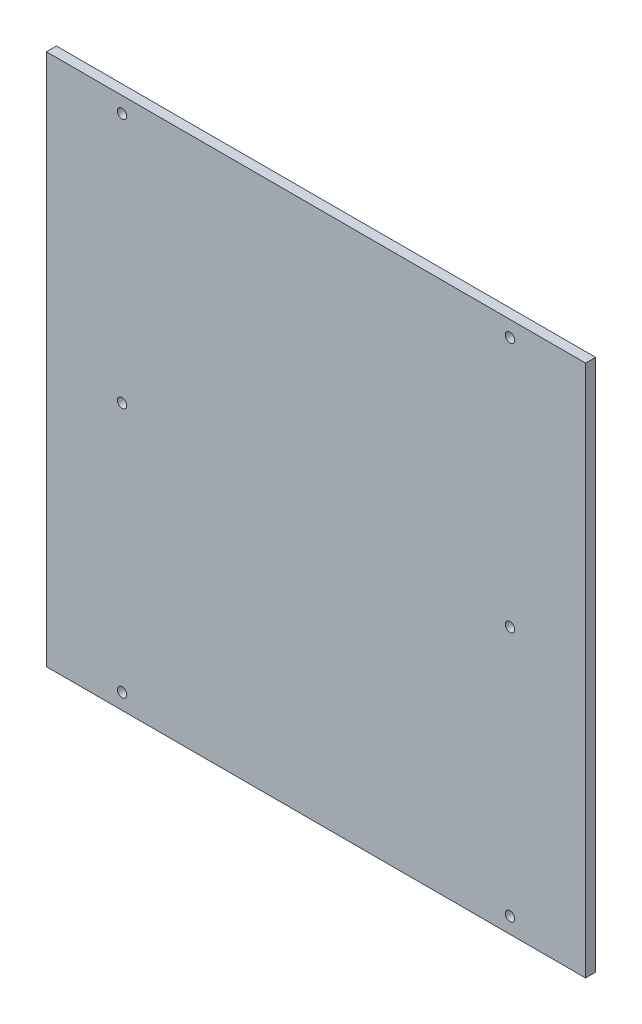
ISO-10303-21;
HEADER;
FILE_DESCRIPTION(('STEP AP214'),'2;1');
FILE_NAME('part.step','',(''),(''),'','','');
FILE_SCHEMA(('AUTOMOTIVE_DESIGN { 1 0 10303 214 1 1 1 1 }'));
ENDSEC;
DATA;
#1=APPLICATION_CONTEXT('core data for automotive mechanical design processes');
#2=APPLICATION_PROTOCOL_DEFINITION('international standard','automotive_design',2000,#1);
#3=PRODUCT_CONTEXT('',#1,'mechanical');
#4=PRODUCT('Part','Part','',(#3));
#5=PRODUCT_RELATED_PRODUCT_CATEGORY('part','',(#4));
#6=PRODUCT_DEFINITION_FORMATION('','',#4);
#7=PRODUCT_DEFINITION_CONTEXT('part definition',#1,'design');
#8=PRODUCT_DEFINITION('design','',#6,#7);
#9=PRODUCT_DEFINITION_SHAPE('','',#8);
#10=(LENGTH_UNIT() NAMED_UNIT(*) SI_UNIT(.MILLI.,.METRE.));
#11=(NAMED_UNIT(*) PLANE_ANGLE_UNIT() SI_UNIT($,.RADIAN.));
#12=(NAMED_UNIT(*) SI_UNIT($,.STERADIAN.) SOLID_ANGLE_UNIT());
#13=UNCERTAINTY_MEASURE_WITH_UNIT(LENGTH_MEASURE(1.E-05),#10,'distance_accuracy_value','');
#14=(GEOMETRIC_REPRESENTATION_CONTEXT(3) GLOBAL_UNCERTAINTY_ASSIGNED_CONTEXT((#13)) GLOBAL_UNIT_ASSIGNED_CONTEXT((#10,
#11,#12)) REPRESENTATION_CONTEXT('',''));
#15=CARTESIAN_POINT('',(0.,0.,0.));
#16=DIRECTION('',(0.,0.,1.));
#17=DIRECTION('',(1.,0.,0.));
#18=AXIS2_PLACEMENT_3D('',#15,#16,#17);
#19=CARTESIAN_POINT('',(0.,0.,3.175));
#20=DIRECTION('',(0.,0.,-1.));
#21=DIRECTION('',(-1.,0.,0.));
#22=AXIS2_PLACEMENT_3D('',#19,#20,#21);
#23=PLANE('',#22);
#24=DIRECTION('',(1.,0.,0.));
#25=VECTOR('',#24,1.);
#26=CARTESIAN_POINT('',(133.35,0.,3.175));
#27=LINE('',#26,#25);
#28=CARTESIAN_POINT('',(-19.05,0.,3.175));
#29=VERTEX_POINT('',#28);
#30=CARTESIAN_POINT('',(152.4,0.,3.175));
#31=VERTEX_POINT('',#30);
#32=EDGE_CURVE('E50',#29,#31,#27,.T.);
#33=ORIENTED_EDGE('',*,*,#32,.T.);
#34=DIRECTION('',(0.,1.,0.));
#35=VECTOR('',#34,1.);
#36=CARTESIAN_POINT('',(152.4,169.333333333333,3.175));
#37=LINE('',#36,#35);
#38=CARTESIAN_POINT('',(152.4,169.333333333333,3.175));
#39=VERTEX_POINT('',#38);
#40=EDGE_CURVE('E79',#31,#39,#37,.T.);
#41=ORIENTED_EDGE('',*,*,#40,.T.);
#42=DIRECTION('',(-1.,0.,0.));
#43=VECTOR('',#42,1.);
#44=CARTESIAN_POINT('',(0.,169.333333333333,3.175));
#45=LINE('',#44,#43);
#46=CARTESIAN_POINT('',(-19.05,169.333333333333,3.175));
#47=VERTEX_POINT('',#46);
#48=EDGE_CURVE('E11',#39,#47,#45,.T.);
#49=ORIENTED_EDGE('',*,*,#48,.T.);
#50=DIRECTION('',(0.,-1.,0.));
#51=VECTOR('',#50,1.);
#52=CARTESIAN_POINT('',(-19.05,169.333333333333,3.175));
#53=LINE('',#52,#51);
#54=EDGE_CURVE('E81',#47,#29,#53,.T.);
#55=ORIENTED_EDGE('',*,*,#54,.T.);
#56=EDGE_LOOP('',(#33,#41,#49,#55));
#57=FACE_BOUND('',#56,.T.);
#58=CARTESIAN_POINT('',(5.,4.99999999999999,3.175));
#59=DIRECTION('',(0.,0.,1.));
#60=DIRECTION('',(1.,0.,0.));
#61=AXIS2_PLACEMENT_3D('',#58,#59,#60);
#62=CIRCLE('',#61,1.5);
#63=CARTESIAN_POINT('',(6.5,4.99999999999999,3.175));
#64=VERTEX_POINT('',#63);
#65=EDGE_CURVE('E159',#64,#64,#62,.T.);
#66=ORIENTED_EDGE('',*,*,#65,.F.);
#67=EDGE_LOOP('',(#66));
#68=FACE_BOUND('',#67,.T.);
#69=CARTESIAN_POINT('',(5.,164.333333333333,3.175));
#70=DIRECTION('',(0.,0.,1.));
#71=DIRECTION('',(-1.,0.,0.));
#72=AXIS2_PLACEMENT_3D('',#69,#70,#71);
#73=CIRCLE('',#72,1.5);
#74=CARTESIAN_POINT('',(3.5,164.333333333333,3.175));
#75=VERTEX_POINT('',#74);
#76=EDGE_CURVE('E151',#75,#75,#73,.T.);
#77=ORIENTED_EDGE('',*,*,#76,.F.);
#78=EDGE_LOOP('',(#77));
#79=FACE_BOUND('',#78,.T.);
#80=CARTESIAN_POINT('',(5.,84.6666666666667,3.175));
#81=DIRECTION('',(0.,0.,1.));
#82=DIRECTION('',(1.,0.,0.));
#83=AXIS2_PLACEMENT_3D('',#80,#81,#82);
#84=CIRCLE('',#83,1.5);
#85=CARTESIAN_POINT('',(6.50000000000001,84.6666666666667,3.175));
#86=VERTEX_POINT('',#85);
#87=EDGE_CURVE('E143',#86,#86,#84,.T.);
#88=ORIENTED_EDGE('',*,*,#87,.F.);
#89=EDGE_LOOP('',(#88));
#90=FACE_BOUND('',#89,.T.);
#91=CARTESIAN_POINT('',(128.35,164.333333333333,3.175));
#92=DIRECTION('',(0.,0.,1.));
#93=DIRECTION('',(1.,0.,0.));
#94=AXIS2_PLACEMENT_3D('',#91,#92,#93);
#95=CIRCLE('',#94,1.5);
#96=CARTESIAN_POINT('',(129.85,164.333333333333,3.175));
#97=VERTEX_POINT('',#96);
#98=EDGE_CURVE('E135',#97,#97,#95,.T.);
#99=ORIENTED_EDGE('',*,*,#98,.F.);
#100=EDGE_LOOP('',(#99));
#101=FACE_BOUND('',#100,.T.);
#102=CARTESIAN_POINT('',(128.35,84.6666666666667,3.175));
#103=DIRECTION('',(0.,0.,1.));
#104=DIRECTION('',(-1.,0.,0.));
#105=AXIS2_PLACEMENT_3D('',#102,#103,#104);
#106=CIRCLE('',#105,1.5);
#107=CARTESIAN_POINT('',(126.85,84.6666666666667,3.175));
#108=VERTEX_POINT('',#107);
#109=EDGE_CURVE('E127',#108,#108,#106,.T.);
#110=ORIENTED_EDGE('',*,*,#109,.F.);
#111=EDGE_LOOP('',(#110));
#112=FACE_BOUND('',#111,.T.);
#113=CARTESIAN_POINT('',(128.35,4.99999999999999,3.175));
#114=DIRECTION('',(0.,0.,1.));
#115=DIRECTION('',(-1.,0.,0.));
#116=AXIS2_PLACEMENT_3D('',#113,#114,#115);
#117=CIRCLE('',#116,1.5);
#118=CARTESIAN_POINT('',(126.85,4.99999999999999,3.175));
#119=VERTEX_POINT('',#118);
#120=EDGE_CURVE('E119',#119,#119,#117,.T.);
#121=ORIENTED_EDGE('',*,*,#120,.F.);
#122=EDGE_LOOP('',(#121));
#123=FACE_BOUND('',#122,.T.);
#124=ADVANCED_FACE('F39',(#57,#68,#79,#90,#101,#112,#123),#23,.F.);
#125=CARTESIAN_POINT('',(0.,0.,0.));
#126=DIRECTION('',(0.,0.,-1.));
#127=DIRECTION('',(-1.,0.,0.));
#128=AXIS2_PLACEMENT_3D('',#125,#126,#127);
#129=PLANE('',#128);
#130=CARTESIAN_POINT('',(128.35,84.6666666666667,0.));
#131=DIRECTION('',(0.,0.,1.));
#132=DIRECTION('',(-1.,0.,0.));
#133=AXIS2_PLACEMENT_3D('',#130,#131,#132);
#134=CIRCLE('',#133,1.5);
#135=CARTESIAN_POINT('',(126.85,84.6666666666667,0.));
#136=VERTEX_POINT('',#135);
#137=EDGE_CURVE('E123',#136,#136,#134,.T.);
#138=ORIENTED_EDGE('',*,*,#137,.T.);
#139=EDGE_LOOP('',(#138));
#140=FACE_BOUND('',#139,.T.);
#141=CARTESIAN_POINT('',(5.,84.6666666666667,0.));
#142=DIRECTION('',(0.,0.,1.));
#143=DIRECTION('',(1.,0.,0.));
#144=AXIS2_PLACEMENT_3D('',#141,#142,#143);
#145=CIRCLE('',#144,1.5);
#146=CARTESIAN_POINT('',(6.50000000000001,84.6666666666667,0.));
#147=VERTEX_POINT('',#146);
#148=EDGE_CURVE('E139',#147,#147,#145,.T.);
#149=ORIENTED_EDGE('',*,*,#148,.T.);
#150=EDGE_LOOP('',(#149));
#151=FACE_BOUND('',#150,.T.);
#152=CARTESIAN_POINT('',(5.,4.99999999999999,0.));
#153=DIRECTION('',(0.,0.,1.));
#154=DIRECTION('',(1.,0.,0.));
#155=AXIS2_PLACEMENT_3D('',#152,#153,#154);
#156=CIRCLE('',#155,1.5);
#157=CARTESIAN_POINT('',(6.5,4.99999999999999,0.));
#158=VERTEX_POINT('',#157);
#159=EDGE_CURVE('E155',#158,#158,#156,.T.);
#160=ORIENTED_EDGE('',*,*,#159,.T.);
#161=EDGE_LOOP('',(#160));
#162=FACE_BOUND('',#161,.T.);
#163=DIRECTION('',(1.,0.,0.));
#164=VECTOR('',#163,1.);
#165=CARTESIAN_POINT('',(133.35,0.,0.));
#166=LINE('',#165,#164);
#167=CARTESIAN_POINT('',(-19.05,0.,0.));
#168=VERTEX_POINT('',#167);
#169=CARTESIAN_POINT('',(152.4,0.,0.));
#170=VERTEX_POINT('',#169);
#171=EDGE_CURVE('E87',#168,#170,#166,.T.);
#172=ORIENTED_EDGE('',*,*,#171,.F.);
#173=DIRECTION('',(0.,-1.,0.));
#174=VECTOR('',#173,1.);
#175=CARTESIAN_POINT('',(-19.05,169.333333333333,0.));
#176=LINE('',#175,#174);
#177=CARTESIAN_POINT('',(-19.05,169.333333333333,0.));
#178=VERTEX_POINT('',#177);
#179=EDGE_CURVE('E108',#178,#168,#176,.T.);
#180=ORIENTED_EDGE('',*,*,#179,.F.);
#181=DIRECTION('',(-1.,0.,0.));
#182=VECTOR('',#181,1.);
#183=CARTESIAN_POINT('',(0.,169.333333333333,0.));
#184=LINE('',#183,#182);
#185=CARTESIAN_POINT('',(152.4,169.333333333333,0.));
#186=VERTEX_POINT('',#185);
#187=EDGE_CURVE('E43',#186,#178,#184,.T.);
#188=ORIENTED_EDGE('',*,*,#187,.F.);
#189=DIRECTION('',(0.,1.,0.));
#190=VECTOR('',#189,1.);
#191=CARTESIAN_POINT('',(152.4,169.333333333333,0.));
#192=LINE('',#191,#190);
#193=EDGE_CURVE('E92',#170,#186,#192,.T.);
#194=ORIENTED_EDGE('',*,*,#193,.F.);
#195=EDGE_LOOP('',(#172,#180,#188,#194));
#196=FACE_BOUND('',#195,.T.);
#197=CARTESIAN_POINT('',(5.,164.333333333333,0.));
#198=DIRECTION('',(0.,0.,1.));
#199=DIRECTION('',(-1.,0.,0.));
#200=AXIS2_PLACEMENT_3D('',#197,#198,#199);
#201=CIRCLE('',#200,1.5);
#202=CARTESIAN_POINT('',(3.5,164.333333333333,0.));
#203=VERTEX_POINT('',#202);
#204=EDGE_CURVE('E147',#203,#203,#201,.T.);
#205=ORIENTED_EDGE('',*,*,#204,.T.);
#206=EDGE_LOOP('',(#205));
#207=FACE_BOUND('',#206,.T.);
#208=CARTESIAN_POINT('',(128.35,164.333333333333,0.));
#209=DIRECTION('',(0.,0.,1.));
#210=DIRECTION('',(1.,0.,0.));
#211=AXIS2_PLACEMENT_3D('',#208,#209,#210);
#212=CIRCLE('',#211,1.5);
#213=CARTESIAN_POINT('',(129.85,164.333333333333,0.));
#214=VERTEX_POINT('',#213);
#215=EDGE_CURVE('E131',#214,#214,#212,.T.);
#216=ORIENTED_EDGE('',*,*,#215,.T.);
#217=EDGE_LOOP('',(#216));
#218=FACE_BOUND('',#217,.T.);
#219=CARTESIAN_POINT('',(128.35,4.99999999999999,0.));
#220=DIRECTION('',(0.,0.,1.));
#221=DIRECTION('',(-1.,0.,0.));
#222=AXIS2_PLACEMENT_3D('',#219,#220,#221);
#223=CIRCLE('',#222,1.5);
#224=CARTESIAN_POINT('',(126.85,4.99999999999999,0.));
#225=VERTEX_POINT('',#224);
#226=EDGE_CURVE('E115',#225,#225,#223,.T.);
#227=ORIENTED_EDGE('',*,*,#226,.T.);
#228=EDGE_LOOP('',(#227));
#229=FACE_BOUND('',#228,.T.);
#230=ADVANCED_FACE('F172',(#140,#151,#162,#196,#207,#218,#229),#129,.T.);
#231=CARTESIAN_POINT('',(133.35,0.,3.175));
#232=DIRECTION('',(0.,1.,0.));
#233=DIRECTION('',(0.,0.,1.));
#234=AXIS2_PLACEMENT_3D('',#231,#232,#233);
#235=PLANE('',#234);
#236=ORIENTED_EDGE('',*,*,#171,.T.);
#237=DIRECTION('',(0.,0.,1.));
#238=VECTOR('',#237,1.);
#239=CARTESIAN_POINT('',(152.4,0.,-170.401526629833));
#240=LINE('',#239,#238);
#241=EDGE_CURVE('E85',#170,#31,#240,.T.);
#242=ORIENTED_EDGE('',*,*,#241,.T.);
#243=ORIENTED_EDGE('',*,*,#32,.F.);
#244=DIRECTION('',(0.,0.,1.));
#245=VECTOR('',#244,1.);
#246=CARTESIAN_POINT('',(-19.05,0.,-170.401526629833));
#247=LINE('',#246,#245);
#248=EDGE_CURVE('E112',#168,#29,#247,.T.);
#249=ORIENTED_EDGE('',*,*,#248,.F.);
#250=EDGE_LOOP('',(#236,#242,#243,#249));
#251=FACE_BOUND('',#250,.T.);
#252=ADVANCED_FACE('F41',(#251),#235,.F.);
#253=CARTESIAN_POINT('',(0.,169.333333333333,3.175));
#254=DIRECTION('',(0.,-1.,0.));
#255=DIRECTION('',(0.,0.,-1.));
#256=AXIS2_PLACEMENT_3D('',#253,#254,#255);
#257=PLANE('',#256);
#258=ORIENTED_EDGE('',*,*,#187,.T.);
#259=DIRECTION('',(0.,0.,1.));
#260=VECTOR('',#259,1.);
#261=CARTESIAN_POINT('',(-19.05,169.333333333333,-170.401526629833));
#262=LINE('',#261,#260);
#263=EDGE_CURVE('E107',#178,#47,#262,.T.);
#264=ORIENTED_EDGE('',*,*,#263,.T.);
#265=ORIENTED_EDGE('',*,*,#48,.F.);
#266=DIRECTION('',(0.,0.,1.));
#267=VECTOR('',#266,1.);
#268=CARTESIAN_POINT('',(152.4,169.333333333333,-170.401526629833));
#269=LINE('',#268,#267);
#270=EDGE_CURVE('E97',#186,#39,#269,.T.);
#271=ORIENTED_EDGE('',*,*,#270,.F.);
#272=EDGE_LOOP('',(#258,#264,#265,#271));
#273=FACE_BOUND('',#272,.T.);
#274=ADVANCED_FACE('F169',(#273),#257,.F.);
#275=CARTESIAN_POINT('',(5.,4.99999999999999,3.175));
#276=DIRECTION('',(0.,0.,-1.));
#277=DIRECTION('',(-1.,0.,0.));
#278=AXIS2_PLACEMENT_3D('',#275,#276,#277);
#279=CYLINDRICAL_SURFACE('',#278,1.5);
#280=ORIENTED_EDGE('',*,*,#65,.T.);
#281=EDGE_LOOP('',(#280));
#282=FACE_BOUND('',#281,.T.);
#283=ORIENTED_EDGE('',*,*,#159,.F.);
#284=EDGE_LOOP('',(#283));
#285=FACE_BOUND('',#284,.T.);
#286=ADVANCED_FACE('F195',(#282,#285),#279,.F.);
#287=CARTESIAN_POINT('',(5.,164.333333333333,3.175));
#288=DIRECTION('',(0.,0.,-1.));
#289=DIRECTION('',(-1.,0.,0.));
#290=AXIS2_PLACEMENT_3D('',#287,#288,#289);
#291=CYLINDRICAL_SURFACE('',#290,1.5);
#292=ORIENTED_EDGE('',*,*,#76,.T.);
#293=EDGE_LOOP('',(#292));
#294=FACE_BOUND('',#293,.T.);
#295=ORIENTED_EDGE('',*,*,#204,.F.);
#296=EDGE_LOOP('',(#295));
#297=FACE_BOUND('',#296,.T.);
#298=ADVANCED_FACE('F202',(#294,#297),#291,.F.);
#299=CARTESIAN_POINT('',(5.,84.6666666666667,3.175));
#300=DIRECTION('',(0.,0.,-1.));
#301=DIRECTION('',(-1.,0.,0.));
#302=AXIS2_PLACEMENT_3D('',#299,#300,#301);
#303=CYLINDRICAL_SURFACE('',#302,1.5);
#304=ORIENTED_EDGE('',*,*,#87,.T.);
#305=EDGE_LOOP('',(#304));
#306=FACE_BOUND('',#305,.T.);
#307=ORIENTED_EDGE('',*,*,#148,.F.);
#308=EDGE_LOOP('',(#307));
#309=FACE_BOUND('',#308,.T.);
#310=ADVANCED_FACE('F242',(#306,#309),#303,.F.);
#311=CARTESIAN_POINT('',(128.35,164.333333333333,3.175));
#312=DIRECTION('',(0.,0.,-1.));
#313=DIRECTION('',(-1.,0.,0.));
#314=AXIS2_PLACEMENT_3D('',#311,#312,#313);
#315=CYLINDRICAL_SURFACE('',#314,1.5);
#316=ORIENTED_EDGE('',*,*,#98,.T.);
#317=EDGE_LOOP('',(#316));
#318=FACE_BOUND('',#317,.T.);
#319=ORIENTED_EDGE('',*,*,#215,.F.);
#320=EDGE_LOOP('',(#319));
#321=FACE_BOUND('',#320,.T.);
#322=ADVANCED_FACE('F232',(#318,#321),#315,.F.);
#323=CARTESIAN_POINT('',(128.35,84.6666666666667,3.175));
#324=DIRECTION('',(0.,0.,-1.));
#325=DIRECTION('',(-1.,0.,0.));
#326=AXIS2_PLACEMENT_3D('',#323,#324,#325);
#327=CYLINDRICAL_SURFACE('',#326,1.5);
#328=ORIENTED_EDGE('',*,*,#109,.T.);
#329=EDGE_LOOP('',(#328));
#330=FACE_BOUND('',#329,.T.);
#331=ORIENTED_EDGE('',*,*,#137,.F.);
#332=EDGE_LOOP('',(#331));
#333=FACE_BOUND('',#332,.T.);
#334=ADVANCED_FACE('F184',(#330,#333),#327,.F.);
#335=CARTESIAN_POINT('',(128.35,4.99999999999999,3.175));
#336=DIRECTION('',(0.,0.,-1.));
#337=DIRECTION('',(-1.,0.,0.));
#338=AXIS2_PLACEMENT_3D('',#335,#336,#337);
#339=CYLINDRICAL_SURFACE('',#338,1.5);
#340=ORIENTED_EDGE('',*,*,#120,.T.);
#341=EDGE_LOOP('',(#340));
#342=FACE_BOUND('',#341,.T.);
#343=ORIENTED_EDGE('',*,*,#226,.F.);
#344=EDGE_LOOP('',(#343));
#345=FACE_BOUND('',#344,.T.);
#346=ADVANCED_FACE('F177',(#342,#345),#339,.F.);
#347=CARTESIAN_POINT('',(-19.05,169.333333333333,-170.401526629833));
#348=DIRECTION('',(-1.,0.,0.));
#349=DIRECTION('',(0.,-1.,0.));
#350=AXIS2_PLACEMENT_3D('',#347,#348,#349);
#351=PLANE('',#350);
#352=ORIENTED_EDGE('',*,*,#263,.F.);
#353=ORIENTED_EDGE('',*,*,#179,.T.);
#354=ORIENTED_EDGE('',*,*,#248,.T.);
#355=ORIENTED_EDGE('',*,*,#54,.F.);
#356=EDGE_LOOP('',(#352,#353,#354,#355));
#357=FACE_BOUND('',#356,.T.);
#358=ADVANCED_FACE('F175',(#357),#351,.T.);
#359=CARTESIAN_POINT('',(152.4,169.333333333333,-170.401526629833));
#360=DIRECTION('',(1.,0.,0.));
#361=DIRECTION('',(0.,1.,0.));
#362=AXIS2_PLACEMENT_3D('',#359,#360,#361);
#363=PLANE('',#362);
#364=ORIENTED_EDGE('',*,*,#241,.F.);
#365=ORIENTED_EDGE('',*,*,#193,.T.);
#366=ORIENTED_EDGE('',*,*,#270,.T.);
#367=ORIENTED_EDGE('',*,*,#40,.F.);
#368=EDGE_LOOP('',(#364,#365,#366,#367));
#369=FACE_BOUND('',#368,.T.);
#370=ADVANCED_FACE('F95',(#369),#363,.T.);
#371=CLOSED_SHELL('',(#124,#230,#252,#274,#286,#298,#310,#322,#334,#346,#358,#370));
#372=MANIFOLD_SOLID_BREP('B2',#371);
#373=ADVANCED_BREP_SHAPE_REPRESENTATION('',(#18,#372),#14);
#374=SHAPE_DEFINITION_REPRESENTATION(#9,#373);
ENDSEC;
END-ISO-10303-21;
